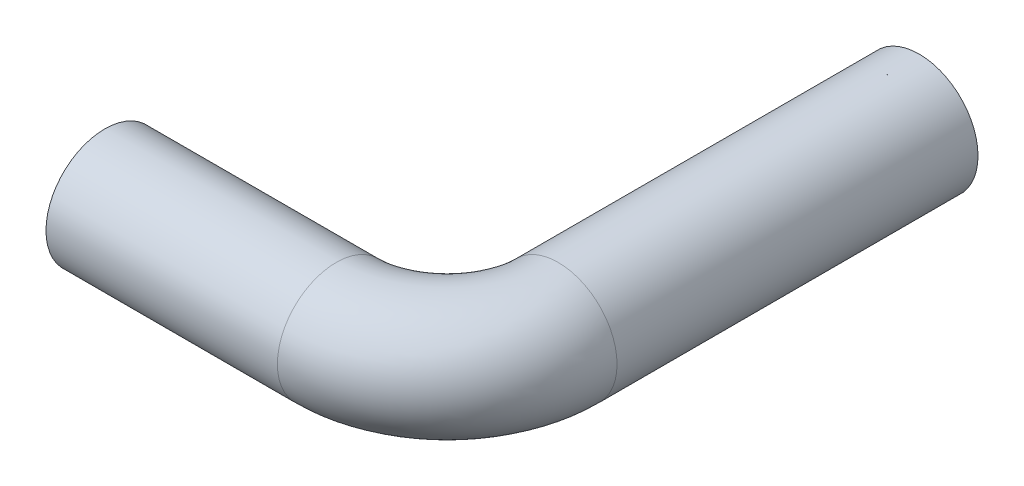
ISO-10303-21;
HEADER;
FILE_DESCRIPTION(('STEP AP214'),'2;1');
FILE_NAME('part.step','',(''),(''),'','','');
FILE_SCHEMA(('AUTOMOTIVE_DESIGN { 1 0 10303 214 1 1 1 1 }'));
ENDSEC;
DATA;
#1=APPLICATION_CONTEXT('core data for automotive mechanical design processes');
#2=APPLICATION_PROTOCOL_DEFINITION('international standard','automotive_design',2000,#1);
#3=PRODUCT_CONTEXT('',#1,'mechanical');
#4=PRODUCT('Part','Part','',(#3));
#5=PRODUCT_RELATED_PRODUCT_CATEGORY('part','',(#4));
#6=PRODUCT_DEFINITION_FORMATION('','',#4);
#7=PRODUCT_DEFINITION_CONTEXT('part definition',#1,'design');
#8=PRODUCT_DEFINITION('design','',#6,#7);
#9=PRODUCT_DEFINITION_SHAPE('','',#8);
#10=(LENGTH_UNIT() NAMED_UNIT(*) SI_UNIT(.MILLI.,.METRE.));
#11=(NAMED_UNIT(*) PLANE_ANGLE_UNIT() SI_UNIT($,.RADIAN.));
#12=(NAMED_UNIT(*) SI_UNIT($,.STERADIAN.) SOLID_ANGLE_UNIT());
#13=UNCERTAINTY_MEASURE_WITH_UNIT(LENGTH_MEASURE(1.E-05),#10,'distance_accuracy_value','');
#14=(GEOMETRIC_REPRESENTATION_CONTEXT(3) GLOBAL_UNCERTAINTY_ASSIGNED_CONTEXT((#13)) GLOBAL_UNIT_ASSIGNED_CONTEXT((#10,
#11,#12)) REPRESENTATION_CONTEXT('',''));
#15=CARTESIAN_POINT('',(0.,0.,0.));
#16=DIRECTION('',(0.,0.,1.));
#17=DIRECTION('',(1.,0.,0.));
#18=AXIS2_PLACEMENT_3D('',#15,#16,#17);
#19=CARTESIAN_POINT('',(182.,326.,199.5));
#20=DIRECTION('',(0.,0.,-1.));
#21=DIRECTION('',(-1.,0.,0.));
#22=AXIS2_PLACEMENT_3D('',#19,#20,#21);
#23=PLANE('',#22);
#24=CARTESIAN_POINT('',(182.,326.,199.5));
#25=DIRECTION('',(0.,0.,-1.));
#26=DIRECTION('',(-1.,0.,0.));
#27=AXIS2_PLACEMENT_3D('',#24,#25,#26);
#28=CIRCLE('',#27,2.17500000000001);
#29=CARTESIAN_POINT('',(179.825,326.,199.5));
#30=VERTEX_POINT('',#29);
#31=EDGE_CURVE('E88',#30,#30,#28,.T.);
#32=ORIENTED_EDGE('',*,*,#31,.F.);
#33=EDGE_LOOP('',(#32));
#34=FACE_BOUND('',#33,.T.);
#35=CARTESIAN_POINT('',(182.,326.,199.5));
#36=DIRECTION('',(0.,0.,-1.));
#37=DIRECTION('',(-1.,0.,0.));
#38=AXIS2_PLACEMENT_3D('',#35,#36,#37);
#39=CIRCLE('',#38,3.17500000000001);
#40=CARTESIAN_POINT('',(178.825,326.,199.5));
#41=VERTEX_POINT('',#40);
#42=EDGE_CURVE('E68',#41,#41,#39,.T.);
#43=ORIENTED_EDGE('',*,*,#42,.T.);
#44=EDGE_LOOP('',(#43));
#45=FACE_BOUND('',#44,.T.);
#46=ADVANCED_FACE('F52',(#34,#45),#23,.T.);
#47=CARTESIAN_POINT('',(163.5,326.,225.));
#48=DIRECTION('',(1.,0.,0.));
#49=DIRECTION('',(0.,0.,-1.));
#50=AXIS2_PLACEMENT_3D('',#47,#48,#49);
#51=PLANE('',#50);
#52=CARTESIAN_POINT('',(163.5,326.,225.));
#53=DIRECTION('',(1.,0.,0.));
#54=DIRECTION('',(0.,0.,-1.));
#55=AXIS2_PLACEMENT_3D('',#52,#53,#54);
#56=CIRCLE('',#55,2.17500000000001);
#57=CARTESIAN_POINT('',(163.5,326.,222.825));
#58=VERTEX_POINT('',#57);
#59=EDGE_CURVE('E71',#58,#58,#56,.T.);
#60=ORIENTED_EDGE('',*,*,#59,.T.);
#61=EDGE_LOOP('',(#60));
#62=FACE_BOUND('',#61,.T.);
#63=CARTESIAN_POINT('',(163.5,326.,225.));
#64=DIRECTION('',(1.,0.,0.));
#65=DIRECTION('',(0.,0.,-1.));
#66=AXIS2_PLACEMENT_3D('',#63,#64,#65);
#67=CIRCLE('',#66,3.17500000000001);
#68=CARTESIAN_POINT('',(163.5,326.,221.825));
#69=VERTEX_POINT('',#68);
#70=EDGE_CURVE('E11',#69,#69,#67,.T.);
#71=ORIENTED_EDGE('',*,*,#70,.F.);
#72=EDGE_LOOP('',(#71));
#73=FACE_BOUND('',#72,.T.);
#74=ADVANCED_FACE('F91',(#62,#73),#51,.F.);
#75=CARTESIAN_POINT('',(182.,326.,199.5));
#76=DIRECTION('',(0.,0.,1.));
#77=DIRECTION('',(1.,0.,0.));
#78=AXIS2_PLACEMENT_3D('',#75,#76,#77);
#79=CYLINDRICAL_SURFACE('',#78,3.17500000000001);
#80=CARTESIAN_POINT('',(182.,326.,219.));
#81=DIRECTION('',(0.,0.,1.));
#82=DIRECTION('',(1.,0.,0.));
#83=AXIS2_PLACEMENT_3D('',#80,#81,#82);
#84=CIRCLE('',#83,3.17500000000001);
#85=CARTESIAN_POINT('',(185.175,326.,219.));
#86=VERTEX_POINT('',#85);
#87=EDGE_CURVE('E63',#86,#86,#84,.F.);
#88=ORIENTED_EDGE('',*,*,#87,.T.);
#89=EDGE_LOOP('',(#88));
#90=FACE_BOUND('',#89,.T.);
#91=ORIENTED_EDGE('',*,*,#42,.F.);
#92=EDGE_LOOP('',(#91));
#93=FACE_BOUND('',#92,.T.);
#94=ADVANCED_FACE('F97',(#90,#93),#79,.T.);
#95=CARTESIAN_POINT('',(176.,326.,219.));
#96=DIRECTION('',(0.,-1.,0.));
#97=DIRECTION('',(0.,0.,-1.));
#98=AXIS2_PLACEMENT_3D('',#95,#96,#97);
#99=TOROIDAL_SURFACE('',#98,6.00000000000001,3.17500000000001);
#100=CARTESIAN_POINT('',(176.,326.,225.));
#101=DIRECTION('',(1.,0.,0.));
#102=DIRECTION('',(0.,0.,-1.));
#103=AXIS2_PLACEMENT_3D('',#100,#101,#102);
#104=CIRCLE('',#103,3.17500000000001);
#105=CARTESIAN_POINT('',(176.,326.,228.175));
#106=VERTEX_POINT('',#105);
#107=EDGE_CURVE('E58',#106,#106,#104,.T.);
#108=CARTESIAN_POINT('',(176.,326.,219.));
#109=DIRECTION('',(0.,-1.,0.));
#110=DIRECTION('',(0.,0.,-1.));
#111=AXIS2_PLACEMENT_3D('',#108,#109,#110);
#112=CIRCLE('',#111,9.17500000000002);
#113=EDGE_CURVE('',#86,#106,#112,.T.);
#114=ORIENTED_EDGE('',*,*,#87,.F.);
#115=ORIENTED_EDGE('',*,*,#107,.T.);
#116=ORIENTED_EDGE('',*,*,#113,.T.);
#117=ORIENTED_EDGE('',*,*,#113,.F.);
#118=EDGE_LOOP('',(#114,#116,#115,#117));
#119=FACE_BOUND('',#118,.T.);
#120=ADVANCED_FACE('F110',(#119),#99,.T.);
#121=CARTESIAN_POINT('',(176.,326.,225.));
#122=DIRECTION('',(-1.,0.,0.));
#123=DIRECTION('',(0.,0.,1.));
#124=AXIS2_PLACEMENT_3D('',#121,#122,#123);
#125=CYLINDRICAL_SURFACE('',#124,3.17500000000001);
#126=ORIENTED_EDGE('',*,*,#70,.T.);
#127=EDGE_LOOP('',(#126));
#128=FACE_BOUND('',#127,.T.);
#129=ORIENTED_EDGE('',*,*,#107,.F.);
#130=EDGE_LOOP('',(#129));
#131=FACE_BOUND('',#130,.T.);
#132=ADVANCED_FACE('F54',(#128,#131),#125,.T.);
#133=CARTESIAN_POINT('',(182.,326.,199.5));
#134=DIRECTION('',(0.,0.,1.));
#135=DIRECTION('',(1.,0.,0.));
#136=AXIS2_PLACEMENT_3D('',#133,#134,#135);
#137=CYLINDRICAL_SURFACE('',#136,2.17500000000001);
#138=CARTESIAN_POINT('',(182.,326.,219.));
#139=DIRECTION('',(0.,0.,-1.));
#140=DIRECTION('',(-1.,0.,0.));
#141=AXIS2_PLACEMENT_3D('',#138,#139,#140);
#142=CIRCLE('',#141,2.17500000000001);
#143=CARTESIAN_POINT('',(184.175,326.,219.));
#144=VERTEX_POINT('',#143);
#145=EDGE_CURVE('E81',#144,#144,#142,.T.);
#146=ORIENTED_EDGE('',*,*,#145,.F.);
#147=EDGE_LOOP('',(#146));
#148=FACE_BOUND('',#147,.T.);
#149=ORIENTED_EDGE('',*,*,#31,.T.);
#150=EDGE_LOOP('',(#149));
#151=FACE_BOUND('',#150,.T.);
#152=ADVANCED_FACE('F89',(#148,#151),#137,.F.);
#153=CARTESIAN_POINT('',(176.,326.,219.));
#154=DIRECTION('',(0.,-1.,0.));
#155=DIRECTION('',(0.,0.,-1.));
#156=AXIS2_PLACEMENT_3D('',#153,#154,#155);
#157=TOROIDAL_SURFACE('',#156,6.00000000000001,2.17500000000001);
#158=CARTESIAN_POINT('',(176.,326.,225.));
#159=DIRECTION('',(1.,0.,0.));
#160=DIRECTION('',(0.,0.,-1.));
#161=AXIS2_PLACEMENT_3D('',#158,#159,#160);
#162=CIRCLE('',#161,2.17500000000001);
#163=CARTESIAN_POINT('',(176.,326.,227.175));
#164=VERTEX_POINT('',#163);
#165=EDGE_CURVE('E76',#164,#164,#162,.T.);
#166=CARTESIAN_POINT('',(176.,326.,219.));
#167=DIRECTION('',(0.,-1.,0.));
#168=DIRECTION('',(0.,0.,-1.));
#169=AXIS2_PLACEMENT_3D('',#166,#167,#168);
#170=CIRCLE('',#169,8.17500000000001);
#171=EDGE_CURVE('',#144,#164,#170,.T.);
#172=ORIENTED_EDGE('',*,*,#145,.T.);
#173=ORIENTED_EDGE('',*,*,#165,.F.);
#174=ORIENTED_EDGE('',*,*,#171,.T.);
#175=ORIENTED_EDGE('',*,*,#171,.F.);
#176=EDGE_LOOP('',(#172,#174,#173,#175));
#177=FACE_BOUND('',#176,.T.);
#178=ADVANCED_FACE('F103',(#177),#157,.F.);
#179=CARTESIAN_POINT('',(176.,326.,225.));
#180=DIRECTION('',(-1.,0.,0.));
#181=DIRECTION('',(0.,0.,1.));
#182=AXIS2_PLACEMENT_3D('',#179,#180,#181);
#183=CYLINDRICAL_SURFACE('',#182,2.17500000000001);
#184=ORIENTED_EDGE('',*,*,#59,.F.);
#185=EDGE_LOOP('',(#184));
#186=FACE_BOUND('',#185,.T.);
#187=ORIENTED_EDGE('',*,*,#165,.T.);
#188=EDGE_LOOP('',(#187));
#189=FACE_BOUND('',#188,.T.);
#190=ADVANCED_FACE('F92',(#186,#189),#183,.F.);
#191=CLOSED_SHELL('',(#46,#74,#94,#120,#132,#152,#178,#190));
#192=MANIFOLD_SOLID_BREP('B2',#191);
#193=ADVANCED_BREP_SHAPE_REPRESENTATION('',(#18,#192),#14);
#194=SHAPE_DEFINITION_REPRESENTATION(#9,#193);
ENDSEC;
END-ISO-10303-21;
